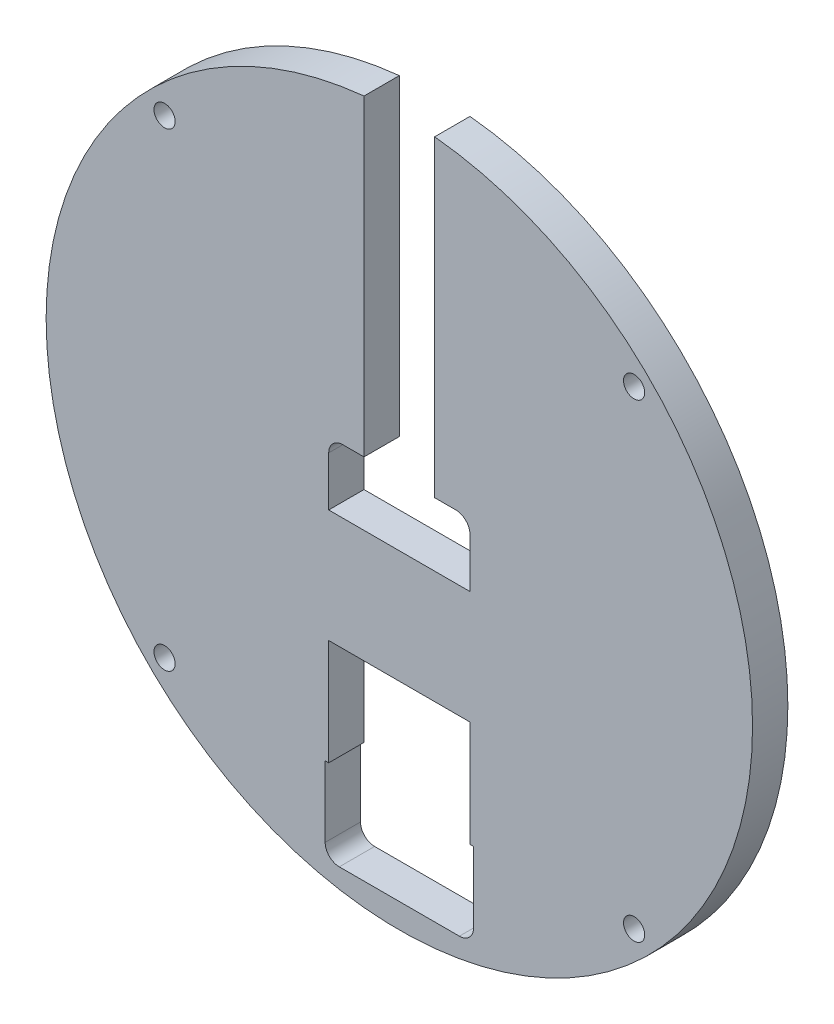
ISO-10303-21;
HEADER;
FILE_DESCRIPTION(('STEP AP214'),'2;1');
FILE_NAME('part.step','',(''),(''),'','','');
FILE_SCHEMA(('AUTOMOTIVE_DESIGN { 1 0 10303 214 1 1 1 1 }'));
ENDSEC;
DATA;
#1=APPLICATION_CONTEXT('core data for automotive mechanical design processes');
#2=APPLICATION_PROTOCOL_DEFINITION('international standard','automotive_design',2000,#1);
#3=PRODUCT_CONTEXT('',#1,'mechanical');
#4=PRODUCT('Part','Part','',(#3));
#5=PRODUCT_RELATED_PRODUCT_CATEGORY('part','',(#4));
#6=PRODUCT_DEFINITION_FORMATION('','',#4);
#7=PRODUCT_DEFINITION_CONTEXT('part definition',#1,'design');
#8=PRODUCT_DEFINITION('design','',#6,#7);
#9=PRODUCT_DEFINITION_SHAPE('','',#8);
#10=(LENGTH_UNIT() NAMED_UNIT(*) SI_UNIT(.MILLI.,.METRE.));
#11=(NAMED_UNIT(*) PLANE_ANGLE_UNIT() SI_UNIT($,.RADIAN.));
#12=(NAMED_UNIT(*) SI_UNIT($,.STERADIAN.) SOLID_ANGLE_UNIT());
#13=UNCERTAINTY_MEASURE_WITH_UNIT(LENGTH_MEASURE(1.E-05),#10,'distance_accuracy_value','');
#14=(GEOMETRIC_REPRESENTATION_CONTEXT(3) GLOBAL_UNCERTAINTY_ASSIGNED_CONTEXT((#13)) GLOBAL_UNIT_ASSIGNED_CONTEXT((#10,
#11,#12)) REPRESENTATION_CONTEXT('',''));
#15=CARTESIAN_POINT('',(0.,0.,0.));
#16=DIRECTION('',(0.,0.,1.));
#17=DIRECTION('',(1.,0.,0.));
#18=AXIS2_PLACEMENT_3D('',#15,#16,#17);
#19=CARTESIAN_POINT('',(0.,-46.5,5.));
#20=DIRECTION('',(0.,1.,0.));
#21=DIRECTION('',(0.,0.,1.));
#22=AXIS2_PLACEMENT_3D('',#19,#20,#21);
#23=PLANE('',#22);
#24=DIRECTION('',(1.,0.,0.));
#25=VECTOR('',#24,1.);
#26=CARTESIAN_POINT('',(0.,-46.5,0.));
#27=LINE('',#26,#25);
#28=CARTESIAN_POINT('',(-8.49999999999999,-46.5,0.));
#29=VERTEX_POINT('',#28);
#30=CARTESIAN_POINT('',(8.50000000000001,-46.5,0.));
#31=VERTEX_POINT('',#30);
#32=EDGE_CURVE('E248',#29,#31,#27,.T.);
#33=ORIENTED_EDGE('',*,*,#32,.F.);
#34=DIRECTION('',(0.,0.,-1.));
#35=VECTOR('',#34,1.);
#36=CARTESIAN_POINT('',(-8.49999999999999,-46.5,5.));
#37=LINE('',#36,#35);
#38=CARTESIAN_POINT('',(-8.49999999999999,-46.5,5.));
#39=VERTEX_POINT('',#38);
#40=EDGE_CURVE('E11',#39,#29,#37,.T.);
#41=ORIENTED_EDGE('',*,*,#40,.F.);
#42=DIRECTION('',(1.,0.,0.));
#43=VECTOR('',#42,1.);
#44=CARTESIAN_POINT('',(0.,-46.5,5.));
#45=LINE('',#44,#43);
#46=CARTESIAN_POINT('',(8.50000000000001,-46.5,5.));
#47=VERTEX_POINT('',#46);
#48=EDGE_CURVE('E659',#39,#47,#45,.T.);
#49=ORIENTED_EDGE('',*,*,#48,.T.);
#50=DIRECTION('',(0.,0.,-1.));
#51=VECTOR('',#50,1.);
#52=CARTESIAN_POINT('',(8.50000000000001,-46.5,5.));
#53=LINE('',#52,#51);
#54=EDGE_CURVE('E56',#47,#31,#53,.T.);
#55=ORIENTED_EDGE('',*,*,#54,.T.);
#56=EDGE_LOOP('',(#33,#41,#49,#55));
#57=FACE_BOUND('',#56,.T.);
#58=ADVANCED_FACE('F37',(#57),#23,.T.);
#59=CARTESIAN_POINT('',(-8.49999999999999,-44.5,5.));
#60=DIRECTION('',(0.,0.,-1.));
#61=DIRECTION('',(-1.,0.,0.));
#62=AXIS2_PLACEMENT_3D('',#59,#60,#61);
#63=CYLINDRICAL_SURFACE('',#62,2.);
#64=CARTESIAN_POINT('',(-8.49999999999999,-44.5,0.));
#65=DIRECTION('',(0.,0.,1.));
#66=DIRECTION('',(1.,0.,0.));
#67=AXIS2_PLACEMENT_3D('',#64,#65,#66);
#68=CIRCLE('',#67,2.);
#69=CARTESIAN_POINT('',(-10.5,-44.5,0.));
#70=VERTEX_POINT('',#69);
#71=EDGE_CURVE('E250',#29,#70,#68,.F.);
#72=ORIENTED_EDGE('',*,*,#71,.T.);
#73=DIRECTION('',(0.,0.,-1.));
#74=VECTOR('',#73,1.);
#75=CARTESIAN_POINT('',(-10.5,-44.5,5.));
#76=LINE('',#75,#74);
#77=CARTESIAN_POINT('',(-10.5,-44.5,5.));
#78=VERTEX_POINT('',#77);
#79=EDGE_CURVE('E47',#78,#70,#76,.T.);
#80=ORIENTED_EDGE('',*,*,#79,.F.);
#81=CARTESIAN_POINT('',(-8.49999999999999,-44.5,5.));
#82=DIRECTION('',(0.,0.,1.));
#83=DIRECTION('',(1.,0.,0.));
#84=AXIS2_PLACEMENT_3D('',#81,#82,#83);
#85=CIRCLE('',#84,2.);
#86=EDGE_CURVE('E657',#39,#78,#85,.F.);
#87=ORIENTED_EDGE('',*,*,#86,.F.);
#88=ORIENTED_EDGE('',*,*,#40,.T.);
#89=EDGE_LOOP('',(#72,#80,#87,#88));
#90=FACE_BOUND('',#89,.T.);
#91=ADVANCED_FACE('F373',(#90),#63,.F.);
#92=CARTESIAN_POINT('',(-10.5,0.,5.));
#93=DIRECTION('',(-1.,0.,0.));
#94=DIRECTION('',(0.,-1.,0.));
#95=AXIS2_PLACEMENT_3D('',#92,#93,#94);
#96=PLANE('',#95);
#97=DIRECTION('',(0.,1.,0.));
#98=VECTOR('',#97,1.);
#99=CARTESIAN_POINT('',(-10.5,0.,0.));
#100=LINE('',#99,#98);
#101=CARTESIAN_POINT('',(-10.5,-34.5,0.));
#102=VERTEX_POINT('',#101);
#103=EDGE_CURVE('E253',#70,#102,#100,.T.);
#104=ORIENTED_EDGE('',*,*,#103,.T.);
#105=DIRECTION('',(0.,0.,-1.));
#106=VECTOR('',#105,1.);
#107=CARTESIAN_POINT('',(-10.5,-34.5,5.));
#108=LINE('',#107,#106);
#109=CARTESIAN_POINT('',(-10.5,-34.5,5.));
#110=VERTEX_POINT('',#109);
#111=EDGE_CURVE('E286',#110,#102,#108,.T.);
#112=ORIENTED_EDGE('',*,*,#111,.F.);
#113=DIRECTION('',(0.,1.,0.));
#114=VECTOR('',#113,1.);
#115=CARTESIAN_POINT('',(-10.5,0.,5.));
#116=LINE('',#115,#114);
#117=EDGE_CURVE('E653',#78,#110,#116,.T.);
#118=ORIENTED_EDGE('',*,*,#117,.F.);
#119=ORIENTED_EDGE('',*,*,#79,.T.);
#120=EDGE_LOOP('',(#104,#112,#118,#119));
#121=FACE_BOUND('',#120,.T.);
#122=ADVANCED_FACE('F378',(#121),#96,.F.);
#123=CARTESIAN_POINT('',(0.,-34.5,5.));
#124=DIRECTION('',(0.,1.,0.));
#125=DIRECTION('',(0.,0.,1.));
#126=AXIS2_PLACEMENT_3D('',#123,#124,#125);
#127=PLANE('',#126);
#128=DIRECTION('',(1.,0.,0.));
#129=VECTOR('',#128,1.);
#130=CARTESIAN_POINT('',(0.,-34.5,0.));
#131=LINE('',#130,#129);
#132=CARTESIAN_POINT('',(-9.99999999999999,-34.5,0.));
#133=VERTEX_POINT('',#132);
#134=EDGE_CURVE('E256',#102,#133,#131,.T.);
#135=ORIENTED_EDGE('',*,*,#134,.T.);
#136=DIRECTION('',(0.,0.,-1.));
#137=VECTOR('',#136,1.);
#138=CARTESIAN_POINT('',(-9.99999999999999,-34.5,5.));
#139=LINE('',#138,#137);
#140=CARTESIAN_POINT('',(-9.99999999999999,-34.5,5.));
#141=VERTEX_POINT('',#140);
#142=EDGE_CURVE('E283',#141,#133,#139,.T.);
#143=ORIENTED_EDGE('',*,*,#142,.F.);
#144=DIRECTION('',(1.,0.,0.));
#145=VECTOR('',#144,1.);
#146=CARTESIAN_POINT('',(0.,-34.5,5.));
#147=LINE('',#146,#145);
#148=EDGE_CURVE('E649',#110,#141,#147,.T.);
#149=ORIENTED_EDGE('',*,*,#148,.F.);
#150=ORIENTED_EDGE('',*,*,#111,.T.);
#151=EDGE_LOOP('',(#135,#143,#149,#150));
#152=FACE_BOUND('',#151,.T.);
#153=ADVANCED_FACE('F598',(#152),#127,.F.);
#154=CARTESIAN_POINT('',(-9.99999999999999,0.,5.));
#155=DIRECTION('',(-1.,0.,0.));
#156=DIRECTION('',(0.,0.,1.));
#157=AXIS2_PLACEMENT_3D('',#154,#155,#156);
#158=PLANE('',#157);
#159=DIRECTION('',(0.,1.,0.));
#160=VECTOR('',#159,1.);
#161=CARTESIAN_POINT('',(-9.99999999999999,0.,0.));
#162=LINE('',#161,#160);
#163=CARTESIAN_POINT('',(-9.99999999999999,-19.5,0.));
#164=VERTEX_POINT('',#163);
#165=EDGE_CURVE('E259',#133,#164,#162,.T.);
#166=ORIENTED_EDGE('',*,*,#165,.T.);
#167=DIRECTION('',(0.,0.,-1.));
#168=VECTOR('',#167,1.);
#169=CARTESIAN_POINT('',(-9.99999999999999,-19.5,5.));
#170=LINE('',#169,#168);
#171=CARTESIAN_POINT('',(-9.99999999999999,-19.5,5.));
#172=VERTEX_POINT('',#171);
#173=EDGE_CURVE('E280',#172,#164,#170,.T.);
#174=ORIENTED_EDGE('',*,*,#173,.F.);
#175=DIRECTION('',(0.,1.,0.));
#176=VECTOR('',#175,1.);
#177=CARTESIAN_POINT('',(-9.99999999999999,0.,5.));
#178=LINE('',#177,#176);
#179=EDGE_CURVE('E652',#141,#172,#178,.T.);
#180=ORIENTED_EDGE('',*,*,#179,.F.);
#181=ORIENTED_EDGE('',*,*,#142,.T.);
#182=EDGE_LOOP('',(#166,#174,#180,#181));
#183=FACE_BOUND('',#182,.T.);
#184=ADVANCED_FACE('F587',(#183),#158,.F.);
#185=CARTESIAN_POINT('',(0.,-19.5,5.));
#186=DIRECTION('',(0.,1.,0.));
#187=DIRECTION('',(0.,0.,1.));
#188=AXIS2_PLACEMENT_3D('',#185,#186,#187);
#189=PLANE('',#188);
#190=DIRECTION('',(1.,0.,0.));
#191=VECTOR('',#190,1.);
#192=CARTESIAN_POINT('',(0.,-19.5,0.));
#193=LINE('',#192,#191);
#194=CARTESIAN_POINT('',(10.,-19.5,0.));
#195=VERTEX_POINT('',#194);
#196=EDGE_CURVE('E262',#164,#195,#193,.T.);
#197=ORIENTED_EDGE('',*,*,#196,.T.);
#198=DIRECTION('',(0.,0.,-1.));
#199=VECTOR('',#198,1.);
#200=CARTESIAN_POINT('',(10.,-19.5,5.));
#201=LINE('',#200,#199);
#202=CARTESIAN_POINT('',(10.,-19.5,5.));
#203=VERTEX_POINT('',#202);
#204=EDGE_CURVE('E278',#203,#195,#201,.T.);
#205=ORIENTED_EDGE('',*,*,#204,.F.);
#206=DIRECTION('',(1.,0.,0.));
#207=VECTOR('',#206,1.);
#208=CARTESIAN_POINT('',(0.,-19.5,5.));
#209=LINE('',#208,#207);
#210=EDGE_CURVE('E664',#172,#203,#209,.T.);
#211=ORIENTED_EDGE('',*,*,#210,.F.);
#212=ORIENTED_EDGE('',*,*,#173,.T.);
#213=EDGE_LOOP('',(#197,#205,#211,#212));
#214=FACE_BOUND('',#213,.T.);
#215=ADVANCED_FACE('F576',(#214),#189,.F.);
#216=CARTESIAN_POINT('',(10.,0.,5.));
#217=DIRECTION('',(-1.,0.,0.));
#218=DIRECTION('',(0.,0.,1.));
#219=AXIS2_PLACEMENT_3D('',#216,#217,#218);
#220=PLANE('',#219);
#221=DIRECTION('',(0.,1.,0.));
#222=VECTOR('',#221,1.);
#223=CARTESIAN_POINT('',(10.,0.,0.));
#224=LINE('',#223,#222);
#225=CARTESIAN_POINT('',(10.,-34.5,0.));
#226=VERTEX_POINT('',#225);
#227=EDGE_CURVE('E265',#226,#195,#224,.T.);
#228=ORIENTED_EDGE('',*,*,#227,.F.);
#229=DIRECTION('',(0.,0.,-1.));
#230=VECTOR('',#229,1.);
#231=CARTESIAN_POINT('',(10.,-34.5,5.));
#232=LINE('',#231,#230);
#233=CARTESIAN_POINT('',(10.,-34.5,5.));
#234=VERTEX_POINT('',#233);
#235=EDGE_CURVE('E201',#234,#226,#232,.T.);
#236=ORIENTED_EDGE('',*,*,#235,.F.);
#237=DIRECTION('',(0.,1.,0.));
#238=VECTOR('',#237,1.);
#239=CARTESIAN_POINT('',(10.,0.,5.));
#240=LINE('',#239,#238);
#241=EDGE_CURVE('E191',#234,#203,#240,.T.);
#242=ORIENTED_EDGE('',*,*,#241,.T.);
#243=ORIENTED_EDGE('',*,*,#204,.T.);
#244=EDGE_LOOP('',(#228,#236,#242,#243));
#245=FACE_BOUND('',#244,.T.);
#246=ADVANCED_FACE('F566',(#245),#220,.T.);
#247=CARTESIAN_POINT('',(-4.78783679369593E-13,-34.4999999999999,5.));
#248=DIRECTION('',(0.,1.,0.));
#249=DIRECTION('',(-1.,0.,0.));
#250=AXIS2_PLACEMENT_3D('',#247,#248,#249);
#251=PLANE('',#250);
#252=DIRECTION('',(1.,0.,0.));
#253=VECTOR('',#252,1.);
#254=CARTESIAN_POINT('',(-4.78783679369593E-13,-34.4999999999999,0.));
#255=LINE('',#254,#253);
#256=CARTESIAN_POINT('',(10.5,-34.5,0.));
#257=VERTEX_POINT('',#256);
#258=EDGE_CURVE('E198',#226,#257,#255,.T.);
#259=ORIENTED_EDGE('',*,*,#258,.T.);
#260=DIRECTION('',(0.,0.,-1.));
#261=VECTOR('',#260,1.);
#262=CARTESIAN_POINT('',(10.5,-34.5,5.));
#263=LINE('',#262,#261);
#264=CARTESIAN_POINT('',(10.5,-34.5,5.));
#265=VERTEX_POINT('',#264);
#266=EDGE_CURVE('E195',#265,#257,#263,.T.);
#267=ORIENTED_EDGE('',*,*,#266,.F.);
#268=DIRECTION('',(1.,0.,0.));
#269=VECTOR('',#268,1.);
#270=CARTESIAN_POINT('',(-4.78783679369593E-13,-34.4999999999999,5.));
#271=LINE('',#270,#269);
#272=EDGE_CURVE('E183',#234,#265,#271,.T.);
#273=ORIENTED_EDGE('',*,*,#272,.F.);
#274=ORIENTED_EDGE('',*,*,#235,.T.);
#275=EDGE_LOOP('',(#259,#267,#273,#274));
#276=FACE_BOUND('',#275,.T.);
#277=ADVANCED_FACE('F196',(#276),#251,.F.);
#278=CARTESIAN_POINT('',(10.5,0.,5.));
#279=DIRECTION('',(-1.,0.,0.));
#280=DIRECTION('',(0.,-1.,0.));
#281=AXIS2_PLACEMENT_3D('',#278,#279,#280);
#282=PLANE('',#281);
#283=DIRECTION('',(0.,1.,0.));
#284=VECTOR('',#283,1.);
#285=CARTESIAN_POINT('',(10.5,0.,0.));
#286=LINE('',#285,#284);
#287=CARTESIAN_POINT('',(10.5,-44.5,0.));
#288=VERTEX_POINT('',#287);
#289=EDGE_CURVE('E269',#288,#257,#286,.T.);
#290=ORIENTED_EDGE('',*,*,#289,.F.);
#291=DIRECTION('',(0.,0.,-1.));
#292=VECTOR('',#291,1.);
#293=CARTESIAN_POINT('',(10.5,-44.5,5.));
#294=LINE('',#293,#292);
#295=CARTESIAN_POINT('',(10.5,-44.5,5.));
#296=VERTEX_POINT('',#295);
#297=EDGE_CURVE('E117',#296,#288,#294,.T.);
#298=ORIENTED_EDGE('',*,*,#297,.F.);
#299=DIRECTION('',(0.,1.,0.));
#300=VECTOR('',#299,1.);
#301=CARTESIAN_POINT('',(10.5,0.,5.));
#302=LINE('',#301,#300);
#303=EDGE_CURVE('E189',#296,#265,#302,.T.);
#304=ORIENTED_EDGE('',*,*,#303,.T.);
#305=ORIENTED_EDGE('',*,*,#266,.T.);
#306=EDGE_LOOP('',(#290,#298,#304,#305));
#307=FACE_BOUND('',#306,.T.);
#308=ADVANCED_FACE('F203',(#307),#282,.T.);
#309=CARTESIAN_POINT('',(-10.,0.,5.));
#310=DIRECTION('',(-1.,0.,0.));
#311=DIRECTION('',(0.,-1.,0.));
#312=AXIS2_PLACEMENT_3D('',#309,#310,#311);
#313=PLANE('',#312);
#314=DIRECTION('',(0.,1.,0.));
#315=VECTOR('',#314,1.);
#316=CARTESIAN_POINT('',(-10.,0.,0.));
#317=LINE('',#316,#315);
#318=CARTESIAN_POINT('',(-9.99999999999999,-3.50000000000001,0.));
#319=VERTEX_POINT('',#318);
#320=CARTESIAN_POINT('',(-10.,3.49999999999999,0.));
#321=VERTEX_POINT('',#320);
#322=EDGE_CURVE('E222',#319,#321,#317,.T.);
#323=ORIENTED_EDGE('',*,*,#322,.T.);
#324=DIRECTION('',(0.,0.,-1.));
#325=VECTOR('',#324,1.);
#326=CARTESIAN_POINT('',(-10.,3.49999999999999,5.));
#327=LINE('',#326,#325);
#328=CARTESIAN_POINT('',(-10.,3.49999999999999,5.));
#329=VERTEX_POINT('',#328);
#330=EDGE_CURVE('E41',#329,#321,#327,.T.);
#331=ORIENTED_EDGE('',*,*,#330,.F.);
#332=DIRECTION('',(0.,1.,0.));
#333=VECTOR('',#332,1.);
#334=CARTESIAN_POINT('',(-10.,0.,5.));
#335=LINE('',#334,#333);
#336=CARTESIAN_POINT('',(-9.99999999999999,-3.50000000000001,5.));
#337=VERTEX_POINT('',#336);
#338=EDGE_CURVE('E680',#337,#329,#335,.T.);
#339=ORIENTED_EDGE('',*,*,#338,.F.);
#340=DIRECTION('',(0.,0.,-1.));
#341=VECTOR('',#340,1.);
#342=CARTESIAN_POINT('',(-9.99999999999999,-3.50000000000001,5.));
#343=LINE('',#342,#341);
#344=EDGE_CURVE('E206',#337,#319,#343,.T.);
#345=ORIENTED_EDGE('',*,*,#344,.T.);
#346=EDGE_LOOP('',(#323,#331,#339,#345));
#347=FACE_BOUND('',#346,.T.);
#348=ADVANCED_FACE('F318',(#347),#313,.F.);
#349=CARTESIAN_POINT('',(-8.00000000000001,3.49999999999999,5.));
#350=DIRECTION('',(0.,0.,-1.));
#351=DIRECTION('',(-1.,0.,0.));
#352=AXIS2_PLACEMENT_3D('',#349,#350,#351);
#353=CYLINDRICAL_SURFACE('',#352,2.);
#354=CARTESIAN_POINT('',(-8.00000000000001,3.49999999999999,0.));
#355=DIRECTION('',(0.,0.,1.));
#356=DIRECTION('',(1.,0.,0.));
#357=AXIS2_PLACEMENT_3D('',#354,#355,#356);
#358=CIRCLE('',#357,2.);
#359=CARTESIAN_POINT('',(-8.00000000000001,5.5,0.));
#360=VERTEX_POINT('',#359);
#361=EDGE_CURVE('E225',#321,#360,#358,.F.);
#362=ORIENTED_EDGE('',*,*,#361,.T.);
#363=DIRECTION('',(0.,0.,-1.));
#364=VECTOR('',#363,1.);
#365=CARTESIAN_POINT('',(-8.00000000000001,5.5,5.));
#366=LINE('',#365,#364);
#367=CARTESIAN_POINT('',(-8.00000000000001,5.5,5.));
#368=VERTEX_POINT('',#367);
#369=EDGE_CURVE('E308',#368,#360,#366,.T.);
#370=ORIENTED_EDGE('',*,*,#369,.F.);
#371=CARTESIAN_POINT('',(-8.00000000000001,3.49999999999999,5.));
#372=DIRECTION('',(0.,0.,1.));
#373=DIRECTION('',(1.,0.,0.));
#374=AXIS2_PLACEMENT_3D('',#371,#372,#373);
#375=CIRCLE('',#374,2.);
#376=EDGE_CURVE('E130',#329,#368,#375,.F.);
#377=ORIENTED_EDGE('',*,*,#376,.F.);
#378=ORIENTED_EDGE('',*,*,#330,.T.);
#379=EDGE_LOOP('',(#362,#370,#377,#378));
#380=FACE_BOUND('',#379,.T.);
#381=ADVANCED_FACE('F314',(#380),#353,.F.);
#382=CARTESIAN_POINT('',(0.,5.50000000000001,5.));
#383=DIRECTION('',(0.,1.,0.));
#384=DIRECTION('',(-1.,0.,0.));
#385=AXIS2_PLACEMENT_3D('',#382,#383,#384);
#386=PLANE('',#385);
#387=DIRECTION('',(1.,0.,0.));
#388=VECTOR('',#387,1.);
#389=CARTESIAN_POINT('',(0.,5.50000000000001,0.));
#390=LINE('',#389,#388);
#391=CARTESIAN_POINT('',(-4.99999999999999,5.5,0.));
#392=VERTEX_POINT('',#391);
#393=EDGE_CURVE('E227',#360,#392,#390,.T.);
#394=ORIENTED_EDGE('',*,*,#393,.T.);
#395=DIRECTION('',(0.,0.,-1.));
#396=VECTOR('',#395,1.);
#397=CARTESIAN_POINT('',(-4.99999999999999,5.5,5.));
#398=LINE('',#397,#396);
#399=CARTESIAN_POINT('',(-4.99999999999999,5.5,5.));
#400=VERTEX_POINT('',#399);
#401=EDGE_CURVE('E307',#400,#392,#398,.T.);
#402=ORIENTED_EDGE('',*,*,#401,.F.);
#403=DIRECTION('',(1.,0.,0.));
#404=VECTOR('',#403,1.);
#405=CARTESIAN_POINT('',(0.,5.50000000000001,5.));
#406=LINE('',#405,#404);
#407=EDGE_CURVE('E677',#368,#400,#406,.T.);
#408=ORIENTED_EDGE('',*,*,#407,.F.);
#409=ORIENTED_EDGE('',*,*,#369,.T.);
#410=EDGE_LOOP('',(#394,#402,#408,#409));
#411=FACE_BOUND('',#410,.T.);
#412=ADVANCED_FACE('F362',(#411),#386,.F.);
#413=CARTESIAN_POINT('',(-4.99999999999999,0.,5.));
#414=DIRECTION('',(1.,0.,0.));
#415=DIRECTION('',(0.,1.,0.));
#416=AXIS2_PLACEMENT_3D('',#413,#414,#415);
#417=PLANE('',#416);
#418=DIRECTION('',(0.,-1.,0.));
#419=VECTOR('',#418,1.);
#420=CARTESIAN_POINT('',(-4.99999999999999,0.,0.));
#421=LINE('',#420,#419);
#422=CARTESIAN_POINT('',(-5.,49.749371855331,0.));
#423=VERTEX_POINT('',#422);
#424=EDGE_CURVE('E230',#423,#392,#421,.T.);
#425=ORIENTED_EDGE('',*,*,#424,.F.);
#426=DIRECTION('',(0.,0.,-1.));
#427=VECTOR('',#426,1.);
#428=CARTESIAN_POINT('',(-5.,49.749371855331,5.));
#429=LINE('',#428,#427);
#430=CARTESIAN_POINT('',(-5.,49.749371855331,5.));
#431=VERTEX_POINT('',#430);
#432=EDGE_CURVE('E305',#431,#423,#429,.T.);
#433=ORIENTED_EDGE('',*,*,#432,.F.);
#434=DIRECTION('',(0.,-1.,0.));
#435=VECTOR('',#434,1.);
#436=CARTESIAN_POINT('',(-4.99999999999999,0.,5.));
#437=LINE('',#436,#435);
#438=EDGE_CURVE('E361',#431,#400,#437,.T.);
#439=ORIENTED_EDGE('',*,*,#438,.T.);
#440=ORIENTED_EDGE('',*,*,#401,.T.);
#441=EDGE_LOOP('',(#425,#433,#439,#440));
#442=FACE_BOUND('',#441,.T.);
#443=ADVANCED_FACE('F356',(#442),#417,.T.);
#444=CARTESIAN_POINT('',(0.,0.,5.));
#445=DIRECTION('',(0.,0.,-1.));
#446=DIRECTION('',(-1.,0.,0.));
#447=AXIS2_PLACEMENT_3D('',#444,#445,#446);
#448=CYLINDRICAL_SURFACE('',#447,50.);
#449=CARTESIAN_POINT('',(0.,0.,0.));
#450=DIRECTION('',(0.,0.,1.));
#451=DIRECTION('',(1.,0.,0.));
#452=AXIS2_PLACEMENT_3D('',#449,#450,#451);
#453=CIRCLE('',#452,50.);
#454=CARTESIAN_POINT('',(5.,49.749371855331,0.));
#455=VERTEX_POINT('',#454);
#456=EDGE_CURVE('E233',#423,#455,#453,.T.);
#457=ORIENTED_EDGE('',*,*,#456,.T.);
#458=DIRECTION('',(0.,0.,-1.));
#459=VECTOR('',#458,1.);
#460=CARTESIAN_POINT('',(5.,49.749371855331,5.));
#461=LINE('',#460,#459);
#462=CARTESIAN_POINT('',(5.,49.749371855331,5.));
#463=VERTEX_POINT('',#462);
#464=EDGE_CURVE('E302',#463,#455,#461,.T.);
#465=ORIENTED_EDGE('',*,*,#464,.F.);
#466=CARTESIAN_POINT('',(0.,0.,5.));
#467=DIRECTION('',(0.,0.,1.));
#468=DIRECTION('',(1.,0.,0.));
#469=AXIS2_PLACEMENT_3D('',#466,#467,#468);
#470=CIRCLE('',#469,50.);
#471=EDGE_CURVE('E674',#431,#463,#470,.T.);
#472=ORIENTED_EDGE('',*,*,#471,.F.);
#473=ORIENTED_EDGE('',*,*,#432,.T.);
#474=EDGE_LOOP('',(#457,#465,#472,#473));
#475=FACE_BOUND('',#474,.T.);
#476=ADVANCED_FACE('F369',(#475),#448,.T.);
#477=CARTESIAN_POINT('',(5.00000000000001,0.,5.));
#478=DIRECTION('',(1.,0.,0.));
#479=DIRECTION('',(0.,1.,0.));
#480=AXIS2_PLACEMENT_3D('',#477,#478,#479);
#481=PLANE('',#480);
#482=DIRECTION('',(0.,-1.,0.));
#483=VECTOR('',#482,1.);
#484=CARTESIAN_POINT('',(5.00000000000001,0.,0.));
#485=LINE('',#484,#483);
#486=CARTESIAN_POINT('',(5.00000000000001,5.5,0.));
#487=VERTEX_POINT('',#486);
#488=EDGE_CURVE('E235',#455,#487,#485,.T.);
#489=ORIENTED_EDGE('',*,*,#488,.T.);
#490=DIRECTION('',(0.,0.,-1.));
#491=VECTOR('',#490,1.);
#492=CARTESIAN_POINT('',(5.00000000000001,5.5,5.));
#493=LINE('',#492,#491);
#494=CARTESIAN_POINT('',(5.00000000000001,5.5,5.));
#495=VERTEX_POINT('',#494);
#496=EDGE_CURVE('E299',#495,#487,#493,.T.);
#497=ORIENTED_EDGE('',*,*,#496,.F.);
#498=DIRECTION('',(0.,-1.,0.));
#499=VECTOR('',#498,1.);
#500=CARTESIAN_POINT('',(5.00000000000001,0.,5.));
#501=LINE('',#500,#499);
#502=EDGE_CURVE('E350',#463,#495,#501,.T.);
#503=ORIENTED_EDGE('',*,*,#502,.F.);
#504=ORIENTED_EDGE('',*,*,#464,.T.);
#505=EDGE_LOOP('',(#489,#497,#503,#504));
#506=FACE_BOUND('',#505,.T.);
#507=ADVANCED_FACE('F349',(#506),#481,.F.);
#508=CARTESIAN_POINT('',(0.,5.50000000000001,5.));
#509=DIRECTION('',(0.,1.,0.));
#510=DIRECTION('',(-1.,0.,0.));
#511=AXIS2_PLACEMENT_3D('',#508,#509,#510);
#512=PLANE('',#511);
#513=DIRECTION('',(1.,0.,0.));
#514=VECTOR('',#513,1.);
#515=CARTESIAN_POINT('',(0.,5.50000000000001,0.));
#516=LINE('',#515,#514);
#517=CARTESIAN_POINT('',(8.00000000000001,5.5,0.));
#518=VERTEX_POINT('',#517);
#519=EDGE_CURVE('E237',#487,#518,#516,.T.);
#520=ORIENTED_EDGE('',*,*,#519,.T.);
#521=DIRECTION('',(0.,0.,-1.));
#522=VECTOR('',#521,1.);
#523=CARTESIAN_POINT('',(8.00000000000001,5.5,5.));
#524=LINE('',#523,#522);
#525=CARTESIAN_POINT('',(8.00000000000001,5.5,5.));
#526=VERTEX_POINT('',#525);
#527=EDGE_CURVE('E296',#526,#518,#524,.T.);
#528=ORIENTED_EDGE('',*,*,#527,.F.);
#529=DIRECTION('',(1.,0.,0.));
#530=VECTOR('',#529,1.);
#531=CARTESIAN_POINT('',(0.,5.50000000000001,5.));
#532=LINE('',#531,#530);
#533=EDGE_CURVE('E345',#495,#526,#532,.T.);
#534=ORIENTED_EDGE('',*,*,#533,.F.);
#535=ORIENTED_EDGE('',*,*,#496,.T.);
#536=EDGE_LOOP('',(#520,#528,#534,#535));
#537=FACE_BOUND('',#536,.T.);
#538=ADVANCED_FACE('F344',(#537),#512,.F.);
#539=CARTESIAN_POINT('',(8.00000000000001,3.5,5.));
#540=DIRECTION('',(0.,0.,-1.));
#541=DIRECTION('',(-1.,0.,0.));
#542=AXIS2_PLACEMENT_3D('',#539,#540,#541);
#543=CYLINDRICAL_SURFACE('',#542,2.);
#544=CARTESIAN_POINT('',(8.00000000000001,3.5,0.));
#545=DIRECTION('',(0.,0.,1.));
#546=DIRECTION('',(1.,0.,0.));
#547=AXIS2_PLACEMENT_3D('',#544,#545,#546);
#548=CIRCLE('',#547,2.);
#549=CARTESIAN_POINT('',(10.,3.5,0.));
#550=VERTEX_POINT('',#549);
#551=EDGE_CURVE('E239',#518,#550,#548,.F.);
#552=ORIENTED_EDGE('',*,*,#551,.T.);
#553=DIRECTION('',(0.,0.,-1.));
#554=VECTOR('',#553,1.);
#555=CARTESIAN_POINT('',(10.,3.5,5.));
#556=LINE('',#555,#554);
#557=CARTESIAN_POINT('',(10.,3.5,5.));
#558=VERTEX_POINT('',#557);
#559=EDGE_CURVE('E294',#558,#550,#556,.T.);
#560=ORIENTED_EDGE('',*,*,#559,.F.);
#561=CARTESIAN_POINT('',(8.00000000000001,3.5,5.));
#562=DIRECTION('',(0.,0.,1.));
#563=DIRECTION('',(1.,0.,0.));
#564=AXIS2_PLACEMENT_3D('',#561,#562,#563);
#565=CIRCLE('',#564,2.);
#566=EDGE_CURVE('E341',#526,#558,#565,.F.);
#567=ORIENTED_EDGE('',*,*,#566,.F.);
#568=ORIENTED_EDGE('',*,*,#527,.T.);
#569=EDGE_LOOP('',(#552,#560,#567,#568));
#570=FACE_BOUND('',#569,.T.);
#571=ADVANCED_FACE('F338',(#570),#543,.F.);
#572=CARTESIAN_POINT('',(10.,0.,5.));
#573=DIRECTION('',(-1.,0.,0.));
#574=DIRECTION('',(0.,-1.,0.));
#575=AXIS2_PLACEMENT_3D('',#572,#573,#574);
#576=PLANE('',#575);
#577=DIRECTION('',(0.,1.,0.));
#578=VECTOR('',#577,1.);
#579=CARTESIAN_POINT('',(10.,0.,0.));
#580=LINE('',#579,#578);
#581=CARTESIAN_POINT('',(10.,-3.50000000000001,0.));
#582=VERTEX_POINT('',#581);
#583=EDGE_CURVE('E242',#582,#550,#580,.T.);
#584=ORIENTED_EDGE('',*,*,#583,.F.);
#585=DIRECTION('',(0.,0.,-1.));
#586=VECTOR('',#585,1.);
#587=CARTESIAN_POINT('',(10.,-3.50000000000001,5.));
#588=LINE('',#587,#586);
#589=CARTESIAN_POINT('',(10.,-3.50000000000001,5.));
#590=VERTEX_POINT('',#589);
#591=EDGE_CURVE('E292',#590,#582,#588,.T.);
#592=ORIENTED_EDGE('',*,*,#591,.F.);
#593=DIRECTION('',(0.,1.,0.));
#594=VECTOR('',#593,1.);
#595=CARTESIAN_POINT('',(10.,0.,5.));
#596=LINE('',#595,#594);
#597=EDGE_CURVE('E667',#590,#558,#596,.T.);
#598=ORIENTED_EDGE('',*,*,#597,.T.);
#599=ORIENTED_EDGE('',*,*,#559,.T.);
#600=EDGE_LOOP('',(#584,#592,#598,#599));
#601=FACE_BOUND('',#600,.T.);
#602=ADVANCED_FACE('F332',(#601),#576,.T.);
#603=CARTESIAN_POINT('',(0.,-3.50000000000001,5.));
#604=DIRECTION('',(0.,1.,0.));
#605=DIRECTION('',(0.,0.,1.));
#606=AXIS2_PLACEMENT_3D('',#603,#604,#605);
#607=PLANE('',#606);
#608=DIRECTION('',(1.,0.,0.));
#609=VECTOR('',#608,1.);
#610=CARTESIAN_POINT('',(0.,-3.50000000000001,0.));
#611=LINE('',#610,#609);
#612=EDGE_CURVE('E245',#319,#582,#611,.T.);
#613=ORIENTED_EDGE('',*,*,#612,.F.);
#614=ORIENTED_EDGE('',*,*,#344,.F.);
#615=DIRECTION('',(1.,0.,0.));
#616=VECTOR('',#615,1.);
#617=CARTESIAN_POINT('',(0.,-3.50000000000001,5.));
#618=LINE('',#617,#616);
#619=EDGE_CURVE('E328',#337,#590,#618,.T.);
#620=ORIENTED_EDGE('',*,*,#619,.T.);
#621=ORIENTED_EDGE('',*,*,#591,.T.);
#622=EDGE_LOOP('',(#613,#614,#620,#621));
#623=FACE_BOUND('',#622,.T.);
#624=ADVANCED_FACE('F324',(#623),#607,.T.);
#625=CARTESIAN_POINT('',(33.2340187157677,33.2340187157678,5.));
#626=DIRECTION('',(0.,0.,-1.));
#627=DIRECTION('',(-1.,0.,0.));
#628=AXIS2_PLACEMENT_3D('',#625,#626,#627);
#629=CYLINDRICAL_SURFACE('',#628,1.5);
#630=CARTESIAN_POINT('',(33.2340187157677,33.2340187157678,5.));
#631=DIRECTION('',(0.,0.,1.));
#632=DIRECTION('',(1.,0.,0.));
#633=AXIS2_PLACEMENT_3D('',#630,#631,#632);
#634=CIRCLE('',#633,1.5);
#635=CARTESIAN_POINT('',(34.7340187157677,33.2340187157678,5.));
#636=VERTEX_POINT('',#635);
#637=EDGE_CURVE('E682',#636,#636,#634,.T.);
#638=ORIENTED_EDGE('',*,*,#637,.T.);
#639=EDGE_LOOP('',(#638));
#640=FACE_BOUND('',#639,.T.);
#641=CARTESIAN_POINT('',(33.2340187157677,33.2340187157678,0.));
#642=DIRECTION('',(0.,0.,1.));
#643=DIRECTION('',(1.,0.,0.));
#644=AXIS2_PLACEMENT_3D('',#641,#642,#643);
#645=CIRCLE('',#644,1.5);
#646=CARTESIAN_POINT('',(34.7340187157677,33.2340187157678,0.));
#647=VERTEX_POINT('',#646);
#648=EDGE_CURVE('E219',#647,#647,#645,.T.);
#649=ORIENTED_EDGE('',*,*,#648,.F.);
#650=EDGE_LOOP('',(#649));
#651=FACE_BOUND('',#650,.T.);
#652=ADVANCED_FACE('F385',(#640,#651),#629,.F.);
#653=CARTESIAN_POINT('',(33.2340187157678,-33.2340187157677,5.));
#654=DIRECTION('',(0.,0.,-1.));
#655=DIRECTION('',(-1.,0.,0.));
#656=AXIS2_PLACEMENT_3D('',#653,#654,#655);
#657=CYLINDRICAL_SURFACE('',#656,1.5);
#658=CARTESIAN_POINT('',(33.2340187157678,-33.2340187157677,5.));
#659=DIRECTION('',(0.,0.,1.));
#660=DIRECTION('',(1.,0.,0.));
#661=AXIS2_PLACEMENT_3D('',#658,#659,#660);
#662=CIRCLE('',#661,1.5);
#663=CARTESIAN_POINT('',(34.7340187157678,-33.2340187157677,5.));
#664=VERTEX_POINT('',#663);
#665=EDGE_CURVE('E685',#664,#664,#662,.T.);
#666=ORIENTED_EDGE('',*,*,#665,.T.);
#667=EDGE_LOOP('',(#666));
#668=FACE_BOUND('',#667,.T.);
#669=CARTESIAN_POINT('',(33.2340187157678,-33.2340187157677,0.));
#670=DIRECTION('',(0.,0.,1.));
#671=DIRECTION('',(1.,0.,0.));
#672=AXIS2_PLACEMENT_3D('',#669,#670,#671);
#673=CIRCLE('',#672,1.5);
#674=CARTESIAN_POINT('',(34.7340187157678,-33.2340187157677,0.));
#675=VERTEX_POINT('',#674);
#676=EDGE_CURVE('E216',#675,#675,#673,.T.);
#677=ORIENTED_EDGE('',*,*,#676,.F.);
#678=EDGE_LOOP('',(#677));
#679=FACE_BOUND('',#678,.T.);
#680=ADVANCED_FACE('F425',(#668,#679),#657,.F.);
#681=CARTESIAN_POINT('',(-33.2340187157677,-33.2340187157678,5.));
#682=DIRECTION('',(0.,0.,-1.));
#683=DIRECTION('',(-1.,0.,0.));
#684=AXIS2_PLACEMENT_3D('',#681,#682,#683);
#685=CYLINDRICAL_SURFACE('',#684,1.50000000000001);
#686=CARTESIAN_POINT('',(-33.2340187157677,-33.2340187157678,5.));
#687=DIRECTION('',(0.,0.,1.));
#688=DIRECTION('',(1.,0.,0.));
#689=AXIS2_PLACEMENT_3D('',#686,#687,#688);
#690=CIRCLE('',#689,1.50000000000001);
#691=CARTESIAN_POINT('',(-31.7340187157677,-33.2340187157678,5.));
#692=VERTEX_POINT('',#691);
#693=EDGE_CURVE('E688',#692,#692,#690,.T.);
#694=ORIENTED_EDGE('',*,*,#693,.T.);
#695=EDGE_LOOP('',(#694));
#696=FACE_BOUND('',#695,.T.);
#697=CARTESIAN_POINT('',(-33.2340187157677,-33.2340187157678,0.));
#698=DIRECTION('',(0.,0.,1.));
#699=DIRECTION('',(1.,0.,0.));
#700=AXIS2_PLACEMENT_3D('',#697,#698,#699);
#701=CIRCLE('',#700,1.50000000000001);
#702=CARTESIAN_POINT('',(-31.7340187157677,-33.2340187157678,0.));
#703=VERTEX_POINT('',#702);
#704=EDGE_CURVE('E213',#703,#703,#701,.T.);
#705=ORIENTED_EDGE('',*,*,#704,.F.);
#706=EDGE_LOOP('',(#705));
#707=FACE_BOUND('',#706,.T.);
#708=ADVANCED_FACE('F433',(#696,#707),#685,.F.);
#709=CARTESIAN_POINT('',(-33.2340187157678,33.2340187157677,5.));
#710=DIRECTION('',(0.,0.,-1.));
#711=DIRECTION('',(-1.,0.,0.));
#712=AXIS2_PLACEMENT_3D('',#709,#710,#711);
#713=CYLINDRICAL_SURFACE('',#712,1.50000000000001);
#714=CARTESIAN_POINT('',(-33.2340187157678,33.2340187157677,5.));
#715=DIRECTION('',(0.,0.,1.));
#716=DIRECTION('',(1.,0.,0.));
#717=AXIS2_PLACEMENT_3D('',#714,#715,#716);
#718=CIRCLE('',#717,1.50000000000001);
#719=CARTESIAN_POINT('',(-31.7340187157678,33.2340187157677,5.));
#720=VERTEX_POINT('',#719);
#721=EDGE_CURVE('E274',#720,#720,#718,.T.);
#722=ORIENTED_EDGE('',*,*,#721,.T.);
#723=EDGE_LOOP('',(#722));
#724=FACE_BOUND('',#723,.T.);
#725=CARTESIAN_POINT('',(-33.2340187157678,33.2340187157677,0.));
#726=DIRECTION('',(0.,0.,1.));
#727=DIRECTION('',(1.,0.,0.));
#728=AXIS2_PLACEMENT_3D('',#725,#726,#727);
#729=CIRCLE('',#728,1.50000000000001);
#730=CARTESIAN_POINT('',(-31.7340187157678,33.2340187157677,0.));
#731=VERTEX_POINT('',#730);
#732=EDGE_CURVE('E210',#731,#731,#729,.T.);
#733=ORIENTED_EDGE('',*,*,#732,.F.);
#734=EDGE_LOOP('',(#733));
#735=FACE_BOUND('',#734,.T.);
#736=ADVANCED_FACE('F39',(#724,#735),#713,.F.);
#737=CARTESIAN_POINT('',(8.50000000000001,-44.5,5.));
#738=DIRECTION('',(0.,0.,-1.));
#739=DIRECTION('',(-1.,0.,0.));
#740=AXIS2_PLACEMENT_3D('',#737,#738,#739);
#741=CYLINDRICAL_SURFACE('',#740,2.);
#742=CARTESIAN_POINT('',(8.50000000000001,-44.5,0.));
#743=DIRECTION('',(0.,0.,1.));
#744=DIRECTION('',(1.,0.,0.));
#745=AXIS2_PLACEMENT_3D('',#742,#743,#744);
#746=CIRCLE('',#745,2.);
#747=EDGE_CURVE('E271',#31,#288,#746,.T.);
#748=ORIENTED_EDGE('',*,*,#747,.F.);
#749=ORIENTED_EDGE('',*,*,#54,.F.);
#750=CARTESIAN_POINT('',(8.50000000000001,-44.5,5.));
#751=DIRECTION('',(0.,0.,1.));
#752=DIRECTION('',(1.,0.,0.));
#753=AXIS2_PLACEMENT_3D('',#750,#751,#752);
#754=CIRCLE('',#753,2.);
#755=EDGE_CURVE('E204',#47,#296,#754,.T.);
#756=ORIENTED_EDGE('',*,*,#755,.T.);
#757=ORIENTED_EDGE('',*,*,#297,.T.);
#758=EDGE_LOOP('',(#748,#749,#756,#757));
#759=FACE_BOUND('',#758,.T.);
#760=ADVANCED_FACE('F447',(#759),#741,.F.);
#761=CARTESIAN_POINT('',(0.,0.,5.));
#762=DIRECTION('',(0.,0.,1.));
#763=DIRECTION('',(1.,0.,0.));
#764=AXIS2_PLACEMENT_3D('',#761,#762,#763);
#765=PLANE('',#764);
#766=ORIENTED_EDGE('',*,*,#721,.F.);
#767=EDGE_LOOP('',(#766));
#768=FACE_BOUND('',#767,.T.);
#769=ORIENTED_EDGE('',*,*,#693,.F.);
#770=EDGE_LOOP('',(#769));
#771=FACE_BOUND('',#770,.T.);
#772=ORIENTED_EDGE('',*,*,#665,.F.);
#773=EDGE_LOOP('',(#772));
#774=FACE_BOUND('',#773,.T.);
#775=ORIENTED_EDGE('',*,*,#637,.F.);
#776=EDGE_LOOP('',(#775));
#777=FACE_BOUND('',#776,.T.);
#778=ORIENTED_EDGE('',*,*,#338,.T.);
#779=ORIENTED_EDGE('',*,*,#376,.T.);
#780=ORIENTED_EDGE('',*,*,#407,.T.);
#781=ORIENTED_EDGE('',*,*,#438,.F.);
#782=ORIENTED_EDGE('',*,*,#471,.T.);
#783=ORIENTED_EDGE('',*,*,#502,.T.);
#784=ORIENTED_EDGE('',*,*,#533,.T.);
#785=ORIENTED_EDGE('',*,*,#566,.T.);
#786=ORIENTED_EDGE('',*,*,#597,.F.);
#787=ORIENTED_EDGE('',*,*,#619,.F.);
#788=EDGE_LOOP('',(#778,#779,#780,#781,#782,#783,#784,#785,#786,#787));
#789=FACE_BOUND('',#788,.T.);
#790=ORIENTED_EDGE('',*,*,#48,.F.);
#791=ORIENTED_EDGE('',*,*,#86,.T.);
#792=ORIENTED_EDGE('',*,*,#117,.T.);
#793=ORIENTED_EDGE('',*,*,#148,.T.);
#794=ORIENTED_EDGE('',*,*,#179,.T.);
#795=ORIENTED_EDGE('',*,*,#210,.T.);
#796=ORIENTED_EDGE('',*,*,#241,.F.);
#797=ORIENTED_EDGE('',*,*,#272,.T.);
#798=ORIENTED_EDGE('',*,*,#303,.F.);
#799=ORIENTED_EDGE('',*,*,#755,.F.);
#800=EDGE_LOOP('',(#790,#791,#792,#793,#794,#795,#796,#797,#798,#799));
#801=FACE_BOUND('',#800,.T.);
#802=ADVANCED_FACE('F186',(#768,#771,#774,#777,#789,#801),#765,.T.);
#803=CARTESIAN_POINT('',(0.,0.,0.));
#804=DIRECTION('',(0.,0.,1.));
#805=DIRECTION('',(1.,0.,0.));
#806=AXIS2_PLACEMENT_3D('',#803,#804,#805);
#807=PLANE('',#806);
#808=ORIENTED_EDGE('',*,*,#732,.T.);
#809=EDGE_LOOP('',(#808));
#810=FACE_BOUND('',#809,.T.);
#811=ORIENTED_EDGE('',*,*,#704,.T.);
#812=EDGE_LOOP('',(#811));
#813=FACE_BOUND('',#812,.T.);
#814=ORIENTED_EDGE('',*,*,#676,.T.);
#815=EDGE_LOOP('',(#814));
#816=FACE_BOUND('',#815,.T.);
#817=ORIENTED_EDGE('',*,*,#648,.T.);
#818=EDGE_LOOP('',(#817));
#819=FACE_BOUND('',#818,.T.);
#820=ORIENTED_EDGE('',*,*,#322,.F.);
#821=ORIENTED_EDGE('',*,*,#612,.T.);
#822=ORIENTED_EDGE('',*,*,#583,.T.);
#823=ORIENTED_EDGE('',*,*,#551,.F.);
#824=ORIENTED_EDGE('',*,*,#519,.F.);
#825=ORIENTED_EDGE('',*,*,#488,.F.);
#826=ORIENTED_EDGE('',*,*,#456,.F.);
#827=ORIENTED_EDGE('',*,*,#424,.T.);
#828=ORIENTED_EDGE('',*,*,#393,.F.);
#829=ORIENTED_EDGE('',*,*,#361,.F.);
#830=EDGE_LOOP('',(#820,#821,#822,#823,#824,#825,#826,#827,#828,#829));
#831=FACE_BOUND('',#830,.T.);
#832=ORIENTED_EDGE('',*,*,#32,.T.);
#833=ORIENTED_EDGE('',*,*,#747,.T.);
#834=ORIENTED_EDGE('',*,*,#289,.T.);
#835=ORIENTED_EDGE('',*,*,#258,.F.);
#836=ORIENTED_EDGE('',*,*,#227,.T.);
#837=ORIENTED_EDGE('',*,*,#196,.F.);
#838=ORIENTED_EDGE('',*,*,#165,.F.);
#839=ORIENTED_EDGE('',*,*,#134,.F.);
#840=ORIENTED_EDGE('',*,*,#103,.F.);
#841=ORIENTED_EDGE('',*,*,#71,.F.);
#842=EDGE_LOOP('',(#832,#833,#834,#835,#836,#837,#838,#839,#840,#841));
#843=FACE_BOUND('',#842,.T.);
#844=ADVANCED_FACE('F321',(#810,#813,#816,#819,#831,#843),#807,.F.);
#845=CLOSED_SHELL('',(#58,#91,#122,#153,#184,#215,#246,#277,#308,#348,#381,#412,#443,#476,#507,
#538,#571,#602,#624,#652,#680,#708,#736,#760,#802,#844));
#846=MANIFOLD_SOLID_BREP('B2',#845);
#847=ADVANCED_BREP_SHAPE_REPRESENTATION('',(#18,#846),#14);
#848=SHAPE_DEFINITION_REPRESENTATION(#9,#847);
ENDSEC;
END-ISO-10303-21;
